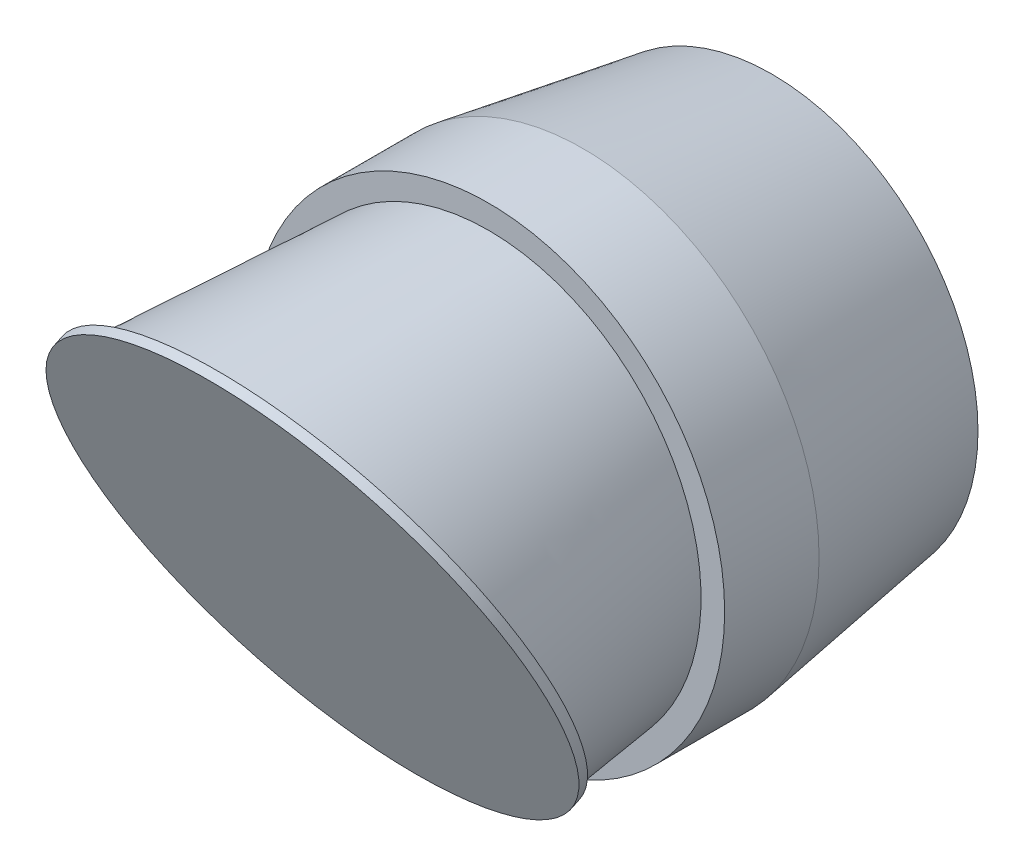
ISO-10303-21;
HEADER;
FILE_DESCRIPTION(('STEP AP214'),'2;1');
FILE_NAME('part.step','',(''),(''),'','','');
FILE_SCHEMA(('AUTOMOTIVE_DESIGN { 1 0 10303 214 1 1 1 1 }'));
ENDSEC;
DATA;
#1=APPLICATION_CONTEXT('core data for automotive mechanical design processes');
#2=APPLICATION_PROTOCOL_DEFINITION('international standard','automotive_design',2000,#1);
#3=PRODUCT_CONTEXT('',#1,'mechanical');
#4=PRODUCT('Part','Part','',(#3));
#5=PRODUCT_RELATED_PRODUCT_CATEGORY('part','',(#4));
#6=PRODUCT_DEFINITION_FORMATION('','',#4);
#7=PRODUCT_DEFINITION_CONTEXT('part definition',#1,'design');
#8=PRODUCT_DEFINITION('design','',#6,#7);
#9=PRODUCT_DEFINITION_SHAPE('','',#8);
#10=(LENGTH_UNIT() NAMED_UNIT(*) SI_UNIT(.MILLI.,.METRE.));
#11=(NAMED_UNIT(*) PLANE_ANGLE_UNIT() SI_UNIT($,.RADIAN.));
#12=(NAMED_UNIT(*) SI_UNIT($,.STERADIAN.) SOLID_ANGLE_UNIT());
#13=UNCERTAINTY_MEASURE_WITH_UNIT(LENGTH_MEASURE(1.E-05),#10,'distance_accuracy_value','');
#14=(GEOMETRIC_REPRESENTATION_CONTEXT(3) GLOBAL_UNCERTAINTY_ASSIGNED_CONTEXT((#13)) GLOBAL_UNIT_ASSIGNED_CONTEXT((#10,
#11,#12)) REPRESENTATION_CONTEXT('',''));
#15=CARTESIAN_POINT('',(0.,0.,0.));
#16=DIRECTION('',(0.,0.,1.));
#17=DIRECTION('',(1.,0.,0.));
#18=AXIS2_PLACEMENT_3D('',#15,#16,#17);
#19=CARTESIAN_POINT('',(-0.0915261603849243,45.3153134300209,58.4354903365128));
#20=CARTESIAN_POINT('',(0.136420864769052,44.9997932144989,0.));
#21=CARTESIAN_POINT('',(1.99180368251297,45.318769716349,58.4371020292964));
#22=CARTESIAN_POINT('',(2.0114122487065,44.9941090118001,0.));
#23=CARTESIAN_POINT('',(4.20687322442163,45.2053319955966,58.3842051513859));
#24=CARTESIAN_POINT('',(4.00440356740127,44.8717692649356,0.));
#25=CARTESIAN_POINT('',(8.88600843009396,44.6452762741459,58.1230468794799));
#26=CARTESIAN_POINT('',(8.21287138961848,44.2951427182916,0.));
#27=CARTESIAN_POINT('',(11.3507489286897,44.1983887328599,57.9146597966442));
#28=CARTESIAN_POINT('',(10.4289539359028,43.8405853040629,0.));
#29=CARTESIAN_POINT('',(16.473473931919,42.8534655410299,57.2875118126636));
#30=CARTESIAN_POINT('',(15.0328583245731,42.4826219835042,0.));
#31=CARTESIAN_POINT('',(19.1321434084322,41.9546959878133,56.8684086870822));
#32=CARTESIAN_POINT('',(17.4212930909019,41.5784842936332,0.));
#33=CARTESIAN_POINT('',(24.5234664819417,39.5837345381366,55.7628112059077));
#34=CARTESIAN_POINT('',(22.2619789213898,39.2004605026345,0.));
#35=CARTESIAN_POINT('',(27.256405564097,38.1102097578422,55.0756953163752));
#36=CARTESIAN_POINT('',(24.7144804836654,37.725249560772,0.));
#37=CARTESIAN_POINT('',(32.5970520547464,34.4938327764405,53.3893510351721));
#38=CARTESIAN_POINT('',(29.5035447573637,34.1107145447033,0.));
#39=CARTESIAN_POINT('',(35.2040025834443,32.3492517405971,52.3893164746243));
#40=CARTESIAN_POINT('',(31.839417937784,31.9696770005361,0.));
#41=CARTESIAN_POINT('',(38.8144809738959,28.6136756898541,50.6473887545425));
#42=CARTESIAN_POINT('',(35.0707738045262,28.2443449257658,0.));
#43=CARTESIAN_POINT('',(39.967462866239,27.2827887015305,50.0267859597484));
#44=CARTESIAN_POINT('',(36.1020193937648,26.9176910575336,0.));
#45=CARTESIAN_POINT('',(42.1345760189165,24.4582205526071,48.7096682009247));
#46=CARTESIAN_POINT('',(38.0387604703795,24.1033316795352,0.));
#47=CARTESIAN_POINT('',(43.1486145302007,22.9645184375814,48.0131434656859));
#48=CARTESIAN_POINT('',(38.9441723834239,22.6156057672877,0.));
#49=CARTESIAN_POINT('',(45.0003894886421,19.8315722116284,46.5522266479362));
#50=CARTESIAN_POINT('',(40.5956235148861,19.4963980850011,0.));
#51=CARTESIAN_POINT('',(45.8380211625777,18.1923378721125,45.7878391219093));
#52=CARTESIAN_POINT('',(41.341568485698,17.8649264767255,0.));
#53=CARTESIAN_POINT('',(47.3030565529074,14.7945221628685,44.2034116356894));
#54=CARTESIAN_POINT('',(42.6436792652381,14.484388202474,0.));
#55=CARTESIAN_POINT('',(47.9303582483154,13.035986557773,43.3833930158952));
#56=CARTESIAN_POINT('',(43.1997534771271,12.7353674285086,0.));
#57=CARTESIAN_POINT('',(48.9474972561602,9.43388789787075,41.7037068253529));
#58=CARTESIAN_POINT('',(44.0977759490185,9.15393032384621,0.));
#59=CARTESIAN_POINT('',(49.3372527930968,7.59040502761342,40.8440766452743));
#60=CARTESIAN_POINT('',(44.4396509990916,7.32159397652263,0.));
#61=CARTESIAN_POINT('',(49.8615783462246,3.85895296529433,39.1040719725767));
#62=CARTESIAN_POINT('',(44.89352205437,3.61386176159297,0.));
#63=CARTESIAN_POINT('',(49.9961026395335,1.97108893145864,38.2237465160437));
#64=CARTESIAN_POINT('',(45.0054774171975,1.7385705191684,0.));
#65=CARTESIAN_POINT('',(50.0037298195655,-1.80518718770977,36.4628400423676));
#66=CARTESIAN_POINT('',(44.9941090118001,-2.01141224870651,0.));
#67=CARTESIAN_POINT('',(49.8768324753335,-3.69348492532732,35.5823123464398));
#68=CARTESIAN_POINT('',(44.8707855878167,-3.8859902226188,0.));
#69=CARTESIAN_POINT('',(49.3675836777205,-7.42665170839009,33.8415080863278));
#70=CARTESIAN_POINT('',(44.394442443503,-7.59090241068915,0.));
#71=CARTESIAN_POINT('',(48.9852775221274,-9.27141544460413,32.9812806286446));
#72=CARTESIAN_POINT('',(44.0414639991588,-9.42113224800847,0.));
#73=CARTESIAN_POINT('',(47.982696047958,-12.8768648616188,31.3000319544001));
#74=CARTESIAN_POINT('',(43.1217433447526,-12.9970587031433,0.));
#75=CARTESIAN_POINT('',(47.3625021804274,-14.6374700870739,30.4790482547827));
#76=CARTESIAN_POINT('',(42.5550748282234,-14.7426757829363,0.));
#77=CARTESIAN_POINT('',(45.9112021221814,-18.0401240557866,28.8923646511204));
#78=CARTESIAN_POINT('',(41.2324913677267,-18.1152570637795,0.));
#79=CARTESIAN_POINT('',(45.0801977669015,-19.6821266962099,28.1266862451804));
#80=CARTESIAN_POINT('',(40.4766682971636,-19.7421759290256,0.));
#81=CARTESIAN_POINT('',(43.2410907891363,-22.8211961699137,26.6629141101117));
#82=CARTESIAN_POINT('',(38.8063353851105,-22.8513133283305,0.));
#83=CARTESIAN_POINT('',(42.2330928996986,-24.3182528842077,25.964825099544));
#84=CARTESIAN_POINT('',(37.8919198511061,-24.3335222722471,0.));
#85=CARTESIAN_POINT('',(40.0774041443407,-27.1499926488908,24.6443631613703));
#86=CARTESIAN_POINT('',(35.9381505701479,-27.1360872229946,0.));
#87=CARTESIAN_POINT('',(38.9298061114948,-28.4846963458211,24.0219806061238));
#88=CARTESIAN_POINT('',(34.898880272287,-28.4564641386531,0.));
#89=CARTESIAN_POINT('',(35.3344418177103,-32.232227035258,22.2744783464686));
#90=CARTESIAN_POINT('',(31.6449966590639,-32.1621356346764,0.));
#91=CARTESIAN_POINT('',(32.7361718185315,-34.3854436371912,21.2704169553206));
#92=CARTESIAN_POINT('',(29.2961850429148,-34.2889711413349,0.));
#93=CARTESIAN_POINT('',(27.4101695135437,-38.0195168045928,19.5758208070656));
#94=CARTESIAN_POINT('',(24.4852934308534,-37.8744030395861,0.));
#95=CARTESIAN_POINT('',(24.6832010661055,-39.5020996818619,18.8844810575456));
#96=CARTESIAN_POINT('',(22.0238925642925,-39.3347170503553,0.));
#97=CARTESIAN_POINT('',(19.3014916481243,-41.8909338102407,17.7705494094206));
#98=CARTESIAN_POINT('',(17.1688774623126,-41.6833474639346,0.));
#99=CARTESIAN_POINT('',(16.6464705785346,-42.7985188835002,17.3473355393325));
#100=CARTESIAN_POINT('',(14.7750047007109,-42.5729871643272,0.));
#101=CARTESIAN_POINT('',(11.5292127379522,-44.1604304138901,16.7122657629821));
#102=CARTESIAN_POINT('',(10.1629514390518,-43.9030114917812,0.));
#103=CARTESIAN_POINT('',(9.06629396427845,-44.6154930415315,16.5000665747727));
#104=CARTESIAN_POINT('',(7.94415358942495,-44.3441241727003,0.));
#105=CARTESIAN_POINT('',(4.38945246769244,-45.1910705174813,16.2316703898759));
#106=CARTESIAN_POINT('',(3.73226696567856,-44.8952236679264,0.));
#107=CARTESIAN_POINT('',(2.17485600328283,-45.3118571436927,16.1753466610707));
#108=CARTESIAN_POINT('',(1.73857051916838,-45.0054774171976,0.));
#109=CARTESIAN_POINT('',(-1.99180368251297,-45.318769716349,16.1721232755036));
#110=CARTESIAN_POINT('',(-2.0114122487065,-44.9941090118001,0.));
#111=CARTESIAN_POINT('',(-4.20687322442164,-45.2053319955966,16.2250201534141));
#112=CARTESIAN_POINT('',(-4.00440356740125,-44.8717692649356,0.));
#113=CARTESIAN_POINT('',(-8.88600843009394,-44.6452762741459,16.48617842532));
#114=CARTESIAN_POINT('',(-8.2128713896185,-44.2951427182916,0.));
#115=CARTESIAN_POINT('',(-11.3507489286896,-44.1983887328599,16.6945655081558));
#116=CARTESIAN_POINT('',(-10.4289539359029,-43.8405853040629,0.));
#117=CARTESIAN_POINT('',(-16.473473931919,-42.8534655410299,17.3217134921364));
#118=CARTESIAN_POINT('',(-15.0328583245731,-42.4826219835042,0.));
#119=CARTESIAN_POINT('',(-19.1321434084321,-41.9546959878133,17.7408166177178));
#120=CARTESIAN_POINT('',(-17.4212930909018,-41.5784842936333,0.));
#121=CARTESIAN_POINT('',(-24.5234664819417,-39.5837345381366,18.8464140988923));
#122=CARTESIAN_POINT('',(-22.2619789213898,-39.2004605026345,0.));
#123=CARTESIAN_POINT('',(-27.256405564097,-38.1102097578422,19.5335299884248));
#124=CARTESIAN_POINT('',(-24.7144804836654,-37.7252495607719,0.));
#125=CARTESIAN_POINT('',(-32.5970520547464,-34.4938327764405,21.2198742696279));
#126=CARTESIAN_POINT('',(-29.5035447573637,-34.1107145447033,0.));
#127=CARTESIAN_POINT('',(-35.2040025834443,-32.3492517405971,22.2199088301756));
#128=CARTESIAN_POINT('',(-31.839417937784,-31.9696770005361,0.));
#129=CARTESIAN_POINT('',(-38.8144809738959,-28.6136756898541,23.9618365502575));
#130=CARTESIAN_POINT('',(-35.0707738045262,-28.2443449257658,0.));
#131=CARTESIAN_POINT('',(-39.967462866239,-27.2827887015305,24.5824393450516));
#132=CARTESIAN_POINT('',(-36.1020193937648,-26.9176910575336,0.));
#133=CARTESIAN_POINT('',(-42.1345760189165,-24.4582205526071,25.8995571038753));
#134=CARTESIAN_POINT('',(-38.0387604703795,-24.1033316795352,0.));
#135=CARTESIAN_POINT('',(-43.1486145302006,-22.9645184375814,26.5960818391141));
#136=CARTESIAN_POINT('',(-38.9441723834239,-22.6156057672877,0.));
#137=CARTESIAN_POINT('',(-45.000389488642,-19.8315722116284,28.0569986568638));
#138=CARTESIAN_POINT('',(-40.5956235148861,-19.4963980850011,0.));
#139=CARTESIAN_POINT('',(-45.8380211625776,-18.1923378721125,28.8213861828907));
#140=CARTESIAN_POINT('',(-41.341568485698,-17.8649264767255,0.));
#141=CARTESIAN_POINT('',(-47.3030565529074,-14.7945221628685,30.4058136691105));
#142=CARTESIAN_POINT('',(-42.6436792652381,-14.484388202474,0.));
#143=CARTESIAN_POINT('',(-47.9303582483154,-13.035986557773,31.2258322889048));
#144=CARTESIAN_POINT('',(-43.1997534771271,-12.7353674285086,0.));
#145=CARTESIAN_POINT('',(-48.9474972561602,-9.43388789787077,32.9055184794471));
#146=CARTESIAN_POINT('',(-44.0977759490185,-9.15393032384621,0.));
#147=CARTESIAN_POINT('',(-49.3372527930968,-7.59040502761344,33.7651486595256));
#148=CARTESIAN_POINT('',(-44.4396509990916,-7.32159397652267,0.));
#149=CARTESIAN_POINT('',(-49.8615783462246,-3.85895296529435,35.5051533322233));
#150=CARTESIAN_POINT('',(-44.8935220543701,-3.61386176159296,0.));
#151=CARTESIAN_POINT('',(-49.9961026395335,-1.97108893145862,36.3854787887563));
#152=CARTESIAN_POINT('',(-45.0054774171976,-1.73857051916839,0.));
#153=CARTESIAN_POINT('',(-50.0037298195655,1.80518718770974,38.1463852624324));
#154=CARTESIAN_POINT('',(-44.9941090118001,2.0114122487065,0.));
#155=CARTESIAN_POINT('',(-49.8768324753335,3.69348492532728,39.0269129583602));
#156=CARTESIAN_POINT('',(-44.8707855878168,3.88599022261881,0.));
#157=CARTESIAN_POINT('',(-49.3675836777205,7.42665170839007,40.7677172184722));
#158=CARTESIAN_POINT('',(-44.3944424435031,7.59090241068915,0.));
#159=CARTESIAN_POINT('',(-48.9852775221274,9.2714154446041,41.6279446761554));
#160=CARTESIAN_POINT('',(-44.0414639991589,9.42113224800847,0.));
#161=CARTESIAN_POINT('',(-47.982696047958,12.8768648616188,43.3091933503998));
#162=CARTESIAN_POINT('',(-43.1217433447526,12.9970587031433,0.));
#163=CARTESIAN_POINT('',(-47.3625021804275,14.6374700870738,44.1301770500173));
#164=CARTESIAN_POINT('',(-42.5550748282234,14.7426757829363,0.));
#165=CARTESIAN_POINT('',(-45.9112021221814,18.0401240557866,45.7168606536795));
#166=CARTESIAN_POINT('',(-41.2324913677267,18.1152570637795,0.));
#167=CARTESIAN_POINT('',(-45.0801977669015,19.6821266962098,46.4825390596196));
#168=CARTESIAN_POINT('',(-40.4766682971637,19.7421759290256,0.));
#169=CARTESIAN_POINT('',(-43.2410907891363,22.8211961699137,47.9463111946883));
#170=CARTESIAN_POINT('',(-38.8063353851105,22.8513133283305,0.));
#171=CARTESIAN_POINT('',(-42.2330928996986,24.3182528842077,48.644400205256));
#172=CARTESIAN_POINT('',(-37.8919198511061,24.3335222722471,0.));
#173=CARTESIAN_POINT('',(-40.0774041443407,27.1499926488908,49.9648621434297));
#174=CARTESIAN_POINT('',(-35.9381505701479,27.1360872229946,0.));
#175=CARTESIAN_POINT('',(-38.9298061114948,28.4846963458212,50.5872446986761));
#176=CARTESIAN_POINT('',(-34.898880272287,28.4564641386531,0.));
#177=CARTESIAN_POINT('',(-35.3344418177103,32.232227035258,52.3347469583314));
#178=CARTESIAN_POINT('',(-31.6449966590639,32.1621356346764,0.));
#179=CARTESIAN_POINT('',(-32.7361718185316,34.3854436371912,53.3388083494794));
#180=CARTESIAN_POINT('',(-29.2961850429148,34.2889711413349,0.));
#181=CARTESIAN_POINT('',(-27.4101695135438,38.0195168045928,55.0334044977343));
#182=CARTESIAN_POINT('',(-24.4852934308533,37.8744030395861,0.));
#183=CARTESIAN_POINT('',(-24.6832010661055,39.5020996818619,55.7247442472544));
#184=CARTESIAN_POINT('',(-22.0238925642926,39.3347170503553,0.));
#185=CARTESIAN_POINT('',(-19.3014916481243,41.8909338102407,56.8386758953794));
#186=CARTESIAN_POINT('',(-17.1688774623126,41.6833474639346,0.));
#187=CARTESIAN_POINT('',(-16.6464705785346,42.7985188835002,57.2618897654675));
#188=CARTESIAN_POINT('',(-14.775004700711,42.5729871643272,0.));
#189=CARTESIAN_POINT('',(-11.5292127379522,44.1604304138901,57.8969595418179));
#190=CARTESIAN_POINT('',(-10.1629514390518,43.9030114917812,0.));
#191=CARTESIAN_POINT('',(-9.06629396427852,44.6154930415315,58.1091587300272));
#192=CARTESIAN_POINT('',(-7.94415358942493,44.3441241727003,0.));
#193=CARTESIAN_POINT('',(-4.38945246769247,45.1910705174812,58.3775549149241));
#194=CARTESIAN_POINT('',(-3.73226696567858,44.8952236679264,0.));
#195=CARTESIAN_POINT('',(-2.1748560032828,45.3118571436928,58.4338786437293));
#196=CARTESIAN_POINT('',(-1.73857051916838,45.0054774171976,0.));
#197=CARTESIAN_POINT('',(-0.0915261603849243,45.3153134300209,58.4354903365128));
#198=CARTESIAN_POINT('',(0.136420864769052,44.9997932144989,0.));
#199=B_SPLINE_SURFACE_WITH_KNOTS('',3,1,((#19,#20),(#21,#22),(#23,#24),(#25,#26),(#27,#28),(#29,
#30),(#31,#32),(#33,#34),(#35,#36),(#37,#38),(#39,#40),(#41,#42),(#43,#44),(#45,#46),(#47,#48),
(#49,#50),(#51,#52),(#53,#54),(#55,#56),(#57,#58),(#59,#60),(#61,#62),(#63,#64),(#65,#66),(#67,
#68),(#69,#70),(#71,#72),(#73,#74),(#75,#76),(#77,#78),(#79,#80),(#81,#82),(#83,#84),(#85,#86),
(#87,#88),(#89,#90),(#91,#92),(#93,#94),(#95,#96),(#97,#98),(#99,#100),(#101,#102),(#103,#104),
(#105,#106),(#107,#108),(#109,#110),(#111,#112),(#113,#114),(#115,#116),(#117,#118),(#119,#120),
(#121,#122),(#123,#124),(#125,#126),(#127,#128),(#129,#130),(#131,#132),(#133,#134),(#135,#136),
(#137,#138),(#139,#140),(#141,#142),(#143,#144),(#145,#146),(#147,#148),(#149,#150),(#151,#152),
(#153,#154),(#155,#156),(#157,#158),(#159,#160),(#161,#162),(#163,#164),(#165,#166),(#167,#168),
(#169,#170),(#171,#172),(#173,#174),(#175,#176),(#177,#178),(#179,#180),(#181,#182),(#183,#184),
(#185,#186),(#187,#188),(#189,#190),(#191,#192),(#193,#194),(#195,#196),(#197,#198)),
.UNSPECIFIED.,.T.,.F.,.F.,(4,2,2,2,2,2,2,2,2,2,2,2,2,2,2,2,2,2,2,2,2,2,2,2,2,2,2,2,2,2,2,2,2,2,
2,2,2,2,2,2,2,2,2,2,4),(2,2),(0.,0.03125,0.0625000000000001,0.0937500000000001,0.125,0.15625,
0.171875,0.1875,0.203125,0.21875,0.234375,0.25,0.265625,0.28125,0.296875,0.3125,0.328125,
0.34375,0.375,0.40625,0.4375,0.46875,0.5,0.53125,0.5625,0.59375,0.625,0.65625,0.671875,0.6875,
0.703125,0.71875,0.734375,0.75,0.765625,0.78125,0.796875,0.8125,0.828125,0.84375,0.875,0.90625,
0.9375,0.96875,1.),(0.,1.),.UNSPECIFIED.);
#200=CARTESIAN_POINT('',(0.,0.,0.));
#201=DIRECTION('',(0.,0.,1.));
#202=DIRECTION('',(1.,0.,0.));
#203=AXIS2_PLACEMENT_3D('',#200,#201,#202);
#204=CIRCLE('',#203,45.);
#205=CARTESIAN_POINT('',(0.136420864769052,44.9997932144989,0.));
#206=VERTEX_POINT('',#205);
#207=EDGE_CURVE('E74',#206,#206,#204,.T.);
#208=CARTESIAN_POINT('',(-0.0828962483198909,45.3033680593241,56.2231642807524));
#209=CARTESIAN_POINT('',(0.614322970114404,45.3044165847627,56.2236532161942));
#210=CARTESIAN_POINT('',(1.31152631421928,45.2922304963553,56.2179707498469));
#211=CARTESIAN_POINT('',(2.70476936651377,45.2411705564025,56.194161108822));
#212=CARTESIAN_POINT('',(3.4008090718102,45.202296638601,56.1760339032487));
#213=CARTESIAN_POINT('',(4.79053986829543,45.0979014032344,56.1273536055223));
#214=CARTESIAN_POINT('',(5.48423061903546,45.0323763767401,56.0967987838672));
#215=CARTESIAN_POINT('',(6.86813861350113,44.8750168674565,56.0234208396048));
#216=CARTESIAN_POINT('',(7.55835498705075,44.7831760978015,55.9805947853838));
#217=CARTESIAN_POINT('',(8.9345259041808,44.5731077564014,55.882638309053));
#218=CARTESIAN_POINT('',(9.620476034464,44.4548564224747,55.8274968064559));
#219=CARTESIAN_POINT('',(10.9863000136747,44.1921327347368,55.704986738885));
#220=CARTESIAN_POINT('',(11.6661733055267,44.0476580023258,55.6376170647519));
#221=CARTESIAN_POINT('',(13.0185656339639,43.7328706532323,55.4908293131793));
#222=CARTESIAN_POINT('',(13.6910849780696,43.5625591214327,55.411411741629));
#223=CARTESIAN_POINT('',(15.0276247289076,43.1964554007139,55.2406947729788));
#224=CARTESIAN_POINT('',(15.691645162942,43.0006632936715,55.1493954140586));
#225=CARTESIAN_POINT('',(17.0096737911965,42.5839399935944,54.9550741479011));
#226=CARTESIAN_POINT('',(17.6636864127556,42.3630203042414,54.8520576049185));
#227=CARTESIAN_POINT('',(18.9607819797835,41.8963681283607,54.6344541216107));
#228=CARTESIAN_POINT('',(19.6038658072617,41.6506376554074,54.5198681202305));
#229=CARTESIAN_POINT('',(20.8780575678954,41.1348439263554,54.2793495543452));
#230=CARTESIAN_POINT('',(21.5091652430984,40.864780146864,54.1534167457781));
#231=CARTESIAN_POINT('',(22.7583096085154,40.3007776636815,53.8904180686516));
#232=CARTESIAN_POINT('',(23.3763454147328,40.006837351784,53.7533514501734));
#233=CARTESIAN_POINT('',(24.5980321716209,39.3957101300157,53.4683781465558));
#234=CARTESIAN_POINT('',(25.2016871770222,39.0785298780552,53.3204745660511));
#235=CARTESIAN_POINT('',(26.3937258079446,38.4214144007535,53.0140565866931));
#236=CARTESIAN_POINT('',(26.9821094282627,38.0814791676599,52.8555421842249));
#237=CARTESIAN_POINT('',(28.1425575928091,37.3794537075423,52.5281823359523));
#238=CARTESIAN_POINT('',(28.7146222039561,37.0173635713872,52.3593369325208));
#239=CARTESIAN_POINT('',(29.8414026293618,36.2716542462271,52.011606963441));
#240=CARTESIAN_POINT('',(30.3961183989058,35.8880350017402,51.8327223719211));
#241=CARTESIAN_POINT('',(31.4873907475535,35.0997821280971,51.4651540203787));
#242=CARTESIAN_POINT('',(32.0239411742115,34.695141494485,51.2764669941246));
#243=CARTESIAN_POINT('',(33.0777746580903,33.865840809442,50.8897577337759));
#244=CARTESIAN_POINT('',(33.5950576599303,33.4411807004765,50.6917354728524));
#245=CARTESIAN_POINT('',(35.1167310532874,32.1381684189927,50.0841308673264));
#246=CARTESIAN_POINT('',(36.0911894614536,31.230608240404,49.660928605814));
#247=CARTESIAN_POINT('',(37.4866017242029,29.8162316783581,49.0013939834171));
#248=CARTESIAN_POINT('',(37.940748437429,29.3358669975876,48.7773962540666));
#249=CARTESIAN_POINT('',(38.8263971010502,28.3582156393799,48.3215099387287));
#250=CARTESIAN_POINT('',(39.2578989831771,27.8609289109347,48.0896213289559));
#251=CARTESIAN_POINT('',(40.0974672607459,26.8503602056943,47.6183854026105));
#252=CARTESIAN_POINT('',(40.5055336209122,26.3370782048245,47.3790380748118));
#253=CARTESIAN_POINT('',(41.297414754756,25.2954400320397,46.8933142178157));
#254=CARTESIAN_POINT('',(41.6812295517761,24.7670838746345,46.6469376953842));
#255=CARTESIAN_POINT('',(42.7970084267108,23.158530715146,45.8968570385653));
#256=CARTESIAN_POINT('',(43.4917495088153,22.0567244618467,45.3830763448489));
#257=CARTESIAN_POINT('',(44.4549224891653,20.367641354685,44.5954439567191));
#258=CARTESIAN_POINT('',(44.7628534897983,19.7984862042705,44.3300425514024));
#259=CARTESIAN_POINT('',(45.3521120862213,18.6489100302908,43.7939863778432));
#260=CARTESIAN_POINT('',(45.6334396907755,18.068489010437,43.5233316113312));
#261=CARTESIAN_POINT('',(46.1688786083611,16.8974375009242,42.9772613243514));
#262=CARTESIAN_POINT('',(46.4229897770759,16.3068069571479,42.7018457786483));
#263=CARTESIAN_POINT('',(46.9035408713656,15.1163675551776,42.1467347689401));
#264=CARTESIAN_POINT('',(47.1299807858795,14.5165586933148,41.8670393032242));
#265=CARTESIAN_POINT('',(47.5549183841089,13.30886641486,41.3038831450861));
#266=CARTESIAN_POINT('',(47.7534160579209,12.7009829954062,41.0204224513293));
#267=CARTESIAN_POINT('',(48.1220130383146,11.4781830831007,40.45022148783));
#268=CARTESIAN_POINT('',(48.292112343699,10.8632665899525,40.1634812179492));
#269=CARTESIAN_POINT('',(48.6039457151178,9.62624594781364,39.586649019224));
#270=CARTESIAN_POINT('',(48.745621668727,9.00412976935535,39.2965514809468));
#271=CARTESIAN_POINT('',(49.0000586688017,7.75505931150467,38.7141003608759));
#272=CARTESIAN_POINT('',(49.1128197119274,7.12810503155347,38.4217467788216));
#273=CARTESIAN_POINT('',(49.3091003790974,5.8704453260467,37.8352904267908));
#274=CARTESIAN_POINT('',(49.3926199459564,5.23973989315776,37.5411876533947));
#275=CARTESIAN_POINT('',(49.5303126798142,3.97570488817377,36.9517584503947));
#276=CARTESIAN_POINT('',(49.5844858273712,3.34237531434054,36.6564320199802));
#277=CARTESIAN_POINT('',(49.6635195402256,2.07421004228951,36.0650768418166));
#278=CARTESIAN_POINT('',(49.6883798606607,1.4393743315347,35.7690480882214));
#279=CARTESIAN_POINT('',(49.7086064357679,0.169316320869723,35.1768103115472));
#280=CARTESIAN_POINT('',(49.7039727101546,-0.465905978781767,34.8806012885889));
#281=CARTESIAN_POINT('',(49.6652780196009,-1.73561189951667,34.2885276941454));
#282=CARTESIAN_POINT('',(49.6312170530758,-2.37009552056031,33.9926631226789));
#283=CARTESIAN_POINT('',(49.5338502647969,-3.63721750422221,33.4017944378808));
#284=CARTESIAN_POINT('',(49.470544427368,-4.26985586585124,33.1067903250105));
#285=CARTESIAN_POINT('',(49.3143651072142,-5.53455543133066,32.5170512323622));
#286=CARTESIAN_POINT('',(49.2213805533817,-6.16660537541652,32.2223215030985));
#287=CARTESIAN_POINT('',(49.0061532437417,-7.42660027670248,31.6347762313926));
#288=CARTESIAN_POINT('',(48.883910360925,-8.05454521607078,31.3419606972655));
#289=CARTESIAN_POINT('',(48.610490003223,-9.30524157989588,30.7587514047872));
#290=CARTESIAN_POINT('',(48.4593125090336,-9.9279930008875,30.4683576480519));
#291=CARTESIAN_POINT('',(48.1281552246824,-11.1671697522478,29.890520039085));
#292=CARTESIAN_POINT('',(47.9481754479972,-11.7835950855764,29.6030761854731));
#293=CARTESIAN_POINT('',(47.5598081780897,-13.0090764209359,29.0316248538689));
#294=CARTESIAN_POINT('',(47.3514201981074,-13.6181322965002,28.747617434849));
#295=CARTESIAN_POINT('',(46.9067162560038,-14.8277493933581,28.183563719149));
#296=CARTESIAN_POINT('',(46.6704003109072,-15.4283106198296,27.9035174200543));
#297=CARTESIAN_POINT('',(45.9199226716421,-17.2157285582814,27.0700307470306));
#298=CARTESIAN_POINT('',(45.3641471485798,-18.3885847743478,26.5231189115642));
#299=CARTESIAN_POINT('',(44.4499103828977,-20.1149612478814,25.7180963410968));
#300=CARTESIAN_POINT('',(44.1310146382624,-20.6860478601862,25.4517942803093));
#301=CARTESIAN_POINT('',(43.4669476071417,-21.8155285423667,24.9251087884704));
#302=CARTESIAN_POINT('',(43.1217764381504,-22.373922668984,24.66472533096));
#303=CARTESIAN_POINT('',(42.0478562317175,-24.0286817500526,23.8930984990562));
#304=CARTESIAN_POINT('',(41.2805658497635,-25.104877478164,23.3912601893642));
#305=CARTESIAN_POINT('',(40.0570584001668,-26.6720495535623,22.6604758489593));
#306=CARTESIAN_POINT('',(39.6370596718401,-27.1866594031332,22.4205093351423));
#307=CARTESIAN_POINT('',(38.7735880975689,-28.1994584150025,21.9482333997359));
#308=CARTESIAN_POINT('',(38.3301168907903,-28.6976487200031,21.7159234452955));
#309=CARTESIAN_POINT('',(37.4204284063959,-29.6766499774902,21.2594076615859));
#310=CARTESIAN_POINT('',(36.9542111329638,-30.1574609331731,21.0352018308262));
#311=CARTESIAN_POINT('',(35.9997702185525,-31.1008729791626,20.5952815689856));
#312=CARTESIAN_POINT('',(35.5115447417904,-31.5634725443404,20.379567849084));
#313=CARTESIAN_POINT('',(34.5130536179746,-32.4705690929393,19.9565817817864));
#314=CARTESIAN_POINT('',(34.0027454128354,-32.9150275925948,19.7493273796649));
#315=CARTESIAN_POINT('',(32.9619212894825,-33.7840672684697,19.3440875235639));
#316=CARTESIAN_POINT('',(32.4314053351719,-34.2086484091794,19.1461020861428));
#317=CARTESIAN_POINT('',(31.3510521179311,-35.0371542501816,18.7597634676573));
#318=CARTESIAN_POINT('',(30.8012141753989,-35.4410782226811,18.5714106259684));
#319=CARTESIAN_POINT('',(29.6831526155511,-36.2273586511223,18.2047620407289));
#320=CARTESIAN_POINT('',(29.1149306617757,-36.609717049957,18.0264653911924));
#321=CARTESIAN_POINT('',(27.9610138215323,-37.3523320372822,17.680178335542));
#322=CARTESIAN_POINT('',(27.375315799134,-37.7125846231934,17.5121897958614));
#323=CARTESIAN_POINT('',(26.1877112751258,-38.4101244041557,17.186921654131));
#324=CARTESIAN_POINT('',(25.5858089304549,-38.7474174122083,17.0296393414339));
#325=CARTESIAN_POINT('',(24.366668565032,-39.3985357851599,16.7260178577611));
#326=CARTESIAN_POINT('',(23.749429136355,-39.7123589848774,16.5796796964262));
#327=CARTESIAN_POINT('',(22.5006986421583,-40.3158772004004,16.2982545306917));
#328=CARTESIAN_POINT('',(21.8692066258862,-40.6055706004886,16.1631682797137));
#329=CARTESIAN_POINT('',(20.596500177048,-41.1588152965433,15.9051860411097));
#330=CARTESIAN_POINT('',(19.9553540345256,-41.4224956303825,15.7822298821356));
#331=CARTESIAN_POINT('',(18.6611564445376,-41.9248529241598,15.5479768289172));
#332=CARTESIAN_POINT('',(18.0081036518642,-42.163527038097,15.436681261785));
#333=CARTESIAN_POINT('',(16.6913646089622,-42.6153134509524,15.2260097976201));
#334=CARTESIAN_POINT('',(16.0276789967762,-42.8284272772002,15.1266331883821));
#335=CARTESIAN_POINT('',(14.6908487297126,-43.2287058885301,14.9399802065233));
#336=CARTESIAN_POINT('',(14.017704061388,-43.4158706367186,14.8527038511063));
#337=CARTESIAN_POINT('',(12.6632625195109,-43.7639118939745,14.690409547494));
#338=CARTESIAN_POINT('',(11.9819664935191,-43.9247911110947,14.6153903365129));
#339=CARTESIAN_POINT('',(10.6123890143793,-44.2197565528697,14.4778456921221));
#340=CARTESIAN_POINT('',(9.92410791440999,-44.3538441251392,14.4153196303094));
#341=CARTESIAN_POINT('',(8.54182556008515,-44.5949251335236,14.3029017098641));
#342=CARTESIAN_POINT('',(7.84782475794462,-44.701920690785,14.2530088621245));
#343=CARTESIAN_POINT('',(6.80349244378417,-44.8420437519504,14.187668405619));
#344=CARTESIAN_POINT('',(6.45479045678543,-44.8853597998358,14.167469800769));
#345=CARTESIAN_POINT('',(5.75641785666414,-44.9651900372901,14.1302443496917));
#346=CARTESIAN_POINT('',(5.4067471869691,-45.0017038207196,14.1132176928503));
#347=CARTESIAN_POINT('',(4.36861785364647,-45.0997993179015,14.0674750112839));
#348=CARTESIAN_POINT('',(3.67899873405947,-45.1515490588499,14.0433437107721));
#349=CARTESIAN_POINT('',(2.29793252100945,-45.2283003221974,14.0075540089001));
#350=CARTESIAN_POINT('',(1.60648537969514,-45.2533011373112,13.9958959373524));
#351=CARTESIAN_POINT('',(0.568841659575597,-45.270828399215,13.9877228409002));
#352=CARTESIAN_POINT('',(0.222820151719702,-45.2733404989365,13.986551429562));
#353=CARTESIAN_POINT('',(-0.469200217191052,-45.2717374839527,13.9872989277251));
#354=CARTESIAN_POINT('',(-0.815199078439621,-45.2676224362986,13.9892178059599));
#355=CARTESIAN_POINT('',(-1.85311445171972,-45.2452599624837,13.999645598755));
#356=CARTESIAN_POINT('',(-2.54480167631585,-45.2169926818978,14.0128268481675));
#357=CARTESIAN_POINT('',(-3.92593572967537,-45.1336985142854,14.0516675564048));
#358=CARTESIAN_POINT('',(-4.61538327934695,-45.0786813260444,14.0773224926117));
#359=CARTESIAN_POINT('',(-5.99117127516512,-44.9421895461595,14.1409696548473));
#360=CARTESIAN_POINT('',(-6.67751132899118,-44.860711703378,14.1789633969062));
#361=CARTESIAN_POINT('',(-8.04564919955119,-44.6715353270825,14.2671777899148));
#362=CARTESIAN_POINT('',(-8.7274478223204,-44.5638415811694,14.3173962083695));
#363=CARTESIAN_POINT('',(-10.0852973346542,-44.3223034121388,14.4300273063252));
#364=CARTESIAN_POINT('',(-10.7613489180794,-44.1884621940697,14.4924384912876));
#365=CARTESIAN_POINT('',(-12.1009578403087,-43.8961770904392,14.6287332734752));
#366=CARTESIAN_POINT('',(-12.7645723903183,-43.7379484250319,14.7025165118942));
#367=CARTESIAN_POINT('',(-14.0837888658961,-43.3966107105033,14.861684902196));
#368=CARTESIAN_POINT('',(-14.7393927052355,-43.2135077357725,14.947067221544));
#369=CARTESIAN_POINT('',(-16.0416543629699,-42.8226559018592,15.1293244249017));
#370=CARTESIAN_POINT('',(-16.6883114644929,-42.6149050803525,15.2262002239582));
#371=CARTESIAN_POINT('',(-17.9715476274415,-42.1751399117721,15.4312660898571));
#372=CARTESIAN_POINT('',(-18.6081259891604,-41.9431238885409,15.5394569383045));
#373=CARTESIAN_POINT('',(-19.8701226302843,-41.4552939277753,15.7669357848869));
#374=CARTESIAN_POINT('',(-20.4955405582704,-41.1994792424409,15.8862241317269));
#375=CARTESIAN_POINT('',(-21.7341135214454,-40.6646500711562,16.1356190701016));
#376=CARTESIAN_POINT('',(-22.3472685063513,-40.3856354901014,16.2657257059844));
#377=CARTESIAN_POINT('',(-24.1668929437338,-39.5144344549683,16.6719734204595));
#378=CARTESIAN_POINT('',(-25.3537856859065,-38.8879886695369,16.9640898876251));
#379=CARTESIAN_POINT('',(-27.0965542732135,-37.8788760118138,17.4346468478625));
#380=CARTESIAN_POINT('',(-27.6753197069389,-37.5280949643831,17.5982187366151));
#381=CARTESIAN_POINT('',(-28.8161207468728,-36.8050279708948,17.9353904130378));
#382=CARTESIAN_POINT('',(-29.3781605381227,-36.4327474741021,18.108987659674));
#383=CARTESIAN_POINT('',(-30.4846272086817,-35.6671976900359,18.465969386683));
#384=CARTESIAN_POINT('',(-31.0290522967441,-35.2739262788949,18.6493548574314));
#385=CARTESIAN_POINT('',(-32.0994414695159,-34.4671913842661,19.0255415168977));
#386=CARTESIAN_POINT('',(-32.6254042541702,-34.0537264837015,19.2183433664093));
#387=CARTESIAN_POINT('',(-33.6579787278293,-33.2073889522513,19.6129970387085));
#388=CARTESIAN_POINT('',(-34.1645900606967,-32.7745159645043,19.8148490279034));
#389=CARTESIAN_POINT('',(-35.1575704481807,-31.8901204437942,20.2272494320484));
#390=CARTESIAN_POINT('',(-35.6439399511594,-31.4385983243564,20.4377976541687));
#391=CARTESIAN_POINT('',(-36.5955599689871,-30.5176201842906,20.8672568138747));
#392=CARTESIAN_POINT('',(-37.0608102807891,-30.0481639913186,21.0861678318259));
#393=CARTESIAN_POINT('',(-37.9693846543743,-29.0921303004457,21.5319736633341));
#394=CARTESIAN_POINT('',(-38.4127085047237,-28.6055526375224,21.7588685538424));
#395=CARTESIAN_POINT('',(-39.2826985631743,-27.6093787172187,22.2233920817343));
#396=CARTESIAN_POINT('',(-39.7090518279491,-27.09955791942,22.4611254240345));
#397=CARTESIAN_POINT('',(-40.5377187812106,-26.0641180261376,22.9439589758313));
#398=CARTESIAN_POINT('',(-40.9400324622215,-25.5384989257409,23.1890591876188));
#399=CARTESIAN_POINT('',(-41.7199261252455,-24.4723720638433,23.6862023078864));
#400=CARTESIAN_POINT('',(-42.0975058166738,-23.9318641275283,23.9382452978836));
#401=CARTESIAN_POINT('',(-42.827289373043,-22.8370244033053,24.4487774457411));
#402=CARTESIAN_POINT('',(-43.179493244136,-22.2826926187488,24.7072666020386));
#403=CARTESIAN_POINT('',(-44.197003154247,-20.6001813062919,25.4918345119696));
#404=CARTESIAN_POINT('',(-44.8233650901708,-19.452270431977,26.0271141435421));
#405=CARTESIAN_POINT('',(-45.6813432977101,-17.6982265659422,26.8450382310139));
#406=CARTESIAN_POINT('',(-45.9537673301418,-17.1081158414443,27.1202113810067));
#407=CARTESIAN_POINT('',(-46.4709227175297,-15.9179440419028,27.675197605653));
#408=CARTESIAN_POINT('',(-46.7156540520626,-15.3178829595213,27.9550106837283));
#409=CARTESIAN_POINT('',(-47.1776709569242,-14.1073851582341,28.5194750786483));
#410=CARTESIAN_POINT('',(-47.3948822453379,-13.4969251998958,28.8041372322184));
#411=CARTESIAN_POINT('',(-47.8007014592425,-12.2682391533867,29.3770829451738));
#412=CARTESIAN_POINT('',(-47.989309388197,-11.6500130661562,29.6653665041206));
#413=CARTESIAN_POINT('',(-48.3374425761111,-10.4068686966525,30.2450542438124));
#414=CARTESIAN_POINT('',(-48.4969677216285,-9.78195038828515,30.5364584367254));
#415=CARTESIAN_POINT('',(-48.7867900771994,-8.52657668233525,31.1218488096562));
#416=CARTESIAN_POINT('',(-48.9170872811296,-7.89612128359267,31.4158349902151));
#417=CARTESIAN_POINT('',(-49.1481606833999,-6.63076732107659,32.0058792332131));
#418=CARTESIAN_POINT('',(-49.2489370695208,-5.99586878559204,32.3019372824609));
#419=CARTESIAN_POINT('',(-49.4206607739921,-4.72282999027188,32.8955650218471));
#420=CARTESIAN_POINT('',(-49.4916080778316,-4.08468972885946,33.1931347127208));
#421=CARTESIAN_POINT('',(-49.6597171003595,-2.16699161201099,34.0873720306367));
#422=CARTESIAN_POINT('',(-49.7121990160452,-0.88386513587707,34.6857037328393));
#423=CARTESIAN_POINT('',(-49.7006359493708,1.03779656814089,35.5817893018061));
#424=CARTESIAN_POINT('',(-49.6818284540979,1.67689951304461,35.8798078993641));
#425=CARTESIAN_POINT('',(-49.6145035038244,2.95387842606053,36.4752729458059));
#426=CARTESIAN_POINT('',(-49.5659860529498,3.5917543943431,36.7727193947691));
#427=CARTESIAN_POINT('',(-49.4392219683358,4.86506245748645,37.3664726958033));
#428=CARTESIAN_POINT('',(-49.3609752831197,5.50049454811369,37.6627795459003));
#429=CARTESIAN_POINT('',(-49.174806640465,6.76778151623064,38.2537251642132));
#430=CARTESIAN_POINT('',(-49.0668846731874,7.39963639253424,38.5483639318762));
#431=CARTESIAN_POINT('',(-48.8217042573406,8.65864606110214,39.1354497820206));
#432=CARTESIAN_POINT('',(-48.684446065731,9.28580089448489,39.4278968836759));
#433=CARTESIAN_POINT('',(-48.3807275355042,10.5342752681487,40.0100700451256));
#434=CARTESIAN_POINT('',(-48.214267309177,11.1555948308584,40.2997961153786));
#435=CARTESIAN_POINT('',(-47.8523894629395,12.3912650847695,40.8759986177317));
#436=CARTESIAN_POINT('',(-47.656971919,13.0056157942495,41.1624750583552));
#437=CARTESIAN_POINT('',(-47.2376545324449,14.2262803535305,41.7316802903863));
#438=CARTESIAN_POINT('',(-47.0137547021419,14.8325942068058,42.014409083414));
#439=CARTESIAN_POINT('',(-46.5386530429043,16.0337839286106,42.5745330495887));
#440=CARTESIAN_POINT('',(-46.2875577158319,16.6286943933681,42.8519443552217));
#441=CARTESIAN_POINT('',(-45.7578176373347,17.8083518834091,43.4020276768277));
#442=CARTESIAN_POINT('',(-45.4791729001919,18.3930989139612,43.6746996952575));
#443=CARTESIAN_POINT('',(-44.8949190137883,19.5514225347728,44.2148348702638));
#444=CARTESIAN_POINT('',(-44.5893098377627,20.1249991139439,44.4822980216696));
#445=CARTESIAN_POINT('',(-43.9515508154361,21.2599027061735,45.0115122579939));
#446=CARTESIAN_POINT('',(-43.6194009742661,21.8212297216001,45.2732633440166));
#447=CARTESIAN_POINT('',(-42.929213393683,22.9306141432292,45.7905777956601));
#448=CARTESIAN_POINT('',(-42.5711770317497,23.4786722534313,46.0461414895613));
#449=CARTESIAN_POINT('',(-41.8298757323148,24.5605913042612,46.5506486284671));
#450=CARTESIAN_POINT('',(-41.4466107869093,25.0944522404411,46.7995920713976));
#451=CARTESIAN_POINT('',(-40.6554431362569,26.1469577643796,47.2903834574606));
#452=CARTESIAN_POINT('',(-40.2475405722702,26.6656024393555,47.5322314412631));
#453=CARTESIAN_POINT('',(-39.4078943173686,27.6867884934787,48.0084183187019));
#454=CARTESIAN_POINT('',(-38.9761506404546,28.1893298820825,48.2427572167476));
#455=CARTESIAN_POINT('',(-38.0911368423733,29.1756673654142,48.7026939387506));
#456=CARTESIAN_POINT('',(-37.6379476151554,29.6595230753007,48.9283195617127));
#457=CARTESIAN_POINT('',(-36.7093675850282,30.6094058702768,49.3712571833597));
#458=CARTESIAN_POINT('',(-36.2339768170288,31.0754329833983,49.5885691951161));
#459=CARTESIAN_POINT('',(-35.2619154024982,31.988889743337,50.014521077669));
#460=CARTESIAN_POINT('',(-34.7652446742188,32.4363193186976,50.2231609151447));
#461=CARTESIAN_POINT('',(-33.7515434560983,33.3118104593321,50.6314091386694));
#462=CARTESIAN_POINT('',(-33.23451291419,33.7398719750691,50.831017501619));
#463=CARTESIAN_POINT('',(-32.1808630686706,34.5759885985838,51.2209050862746));
#464=CARTESIAN_POINT('',(-31.6442388482625,34.9840386236868,51.4111819378905));
#465=CARTESIAN_POINT('',(-30.5524620714651,35.7791426501832,51.7819450344756));
#466=CARTESIAN_POINT('',(-29.9973095699296,36.1661967137272,51.9624313084262));
#467=CARTESIAN_POINT('',(-28.3054427717003,37.2948968999211,52.4887528490094));
#468=CARTESIAN_POINT('',(-27.1420623144055,38.0042848344571,52.8195458754863));
#469=CARTESIAN_POINT('',(-25.3520320545511,38.998877578878,53.2833320889551));
#470=CARTESIAN_POINT('',(-24.7483050304568,39.3186252606964,53.4324328816643));
#471=CARTESIAN_POINT('',(-23.5264430272916,39.9347784231567,53.719749819916));
#472=CARTESIAN_POINT('',(-22.9083080291963,40.231183872975,53.8579659510851));
#473=CARTESIAN_POINT('',(-21.6587538047775,40.8000947730061,54.1232534605775));
#474=CARTESIAN_POINT('',(-21.0273336372978,41.0725985228435,54.2503240460027));
#475=CARTESIAN_POINT('',(-19.752371577555,41.593212747171,54.493090445751));
#476=CARTESIAN_POINT('',(-19.1088297793152,41.8413234107769,54.6087863482604));
#477=CARTESIAN_POINT('',(-17.8114566121453,42.3123824396906,54.8284447808859));
#478=CARTESIAN_POINT('',(-17.1576376746596,42.5353588849011,54.9324204048757));
#479=CARTESIAN_POINT('',(-15.8402374875414,42.9560767156063,55.1286043512559));
#480=CARTESIAN_POINT('',(-15.1766560149998,43.1538175238923,55.2208124044894));
#481=CARTESIAN_POINT('',(-13.1733599960858,43.7087130587681,55.479564441878));
#482=CARTESIAN_POINT('',(-11.8204435164491,44.0277767528862,55.6283462858845));
#483=CARTESIAN_POINT('',(-9.60381034689813,44.460670769549,55.8302080810239));
#484=CARTESIAN_POINT('',(-8.74749597039746,44.6065561882614,55.8982355689826));
#485=CARTESIAN_POINT('',(-7.45767645847937,44.7946123047453,55.9859275762619));
#486=CARTESIAN_POINT('',(-7.02687641574169,44.85216598077,56.0127652961472));
#487=CARTESIAN_POINT('',(-6.16375270536257,44.957043507887,56.0616704902102));
#488=CARTESIAN_POINT('',(-5.73142901429719,45.0043672010043,56.083737890723));
#489=CARTESIAN_POINT('',(-4.86555010032401,45.0886853161013,56.1230560735139));
#490=CARTESIAN_POINT('',(-4.43199486622234,45.1256796438886,56.1403068118695));
#491=CARTESIAN_POINT('',(-3.56397914272015,45.1892810450085,56.1699646322811));
#492=CARTESIAN_POINT('',(-3.12951867165263,45.2158883266847,56.1823718114893));
#493=CARTESIAN_POINT('',(-1.82500222716225,45.2800920500091,56.2123104993576));
#494=CARTESIAN_POINT('',(-0.953936849675615,45.3020581295281,56.2225534504569));
#495=CARTESIAN_POINT('',(-0.0828962483198909,45.3033680593241,56.2231642807524));
#496=B_SPLINE_CURVE_WITH_KNOTS('',3,(#208,#209,#210,#211,#212,#213,#214,#215,#216,#217,#218,
#219,#220,#221,#222,#223,#224,#225,#226,#227,#228,#229,#230,#231,#232,#233,#234,#235,#236,#237,
#238,#239,#240,#241,#242,#243,#244,#245,#246,#247,#248,#249,#250,#251,#252,#253,#254,#255,#256,
#257,#258,#259,#260,#261,#262,#263,#264,#265,#266,#267,#268,#269,#270,#271,#272,#273,#274,#275,
#276,#277,#278,#279,#280,#281,#282,#283,#284,#285,#286,#287,#288,#289,#290,#291,#292,#293,#294,
#295,#296,#297,#298,#299,#300,#301,#302,#303,#304,#305,#306,#307,#308,#309,#310,#311,#312,#313,
#314,#315,#316,#317,#318,#319,#320,#321,#322,#323,#324,#325,#326,#327,#328,#329,#330,#331,#332,
#333,#334,#335,#336,#337,#338,#339,#340,#341,#342,#343,#344,#345,#346,#347,#348,#349,#350,#351,
#352,#353,#354,#355,#356,#357,#358,#359,#360,#361,#362,#363,#364,#365,#366,#367,#368,#369,#370,
#371,#372,#373,#374,#375,#376,#377,#378,#379,#380,#381,#382,#383,#384,#385,#386,#387,#388,#389,
#390,#391,#392,#393,#394,#395,#396,#397,#398,#399,#400,#401,#402,#403,#404,#405,#406,#407,#408,
#409,#410,#411,#412,#413,#414,#415,#416,#417,#418,#419,#420,#421,#422,#423,#424,#425,#426,#427,
#428,#429,#430,#431,#432,#433,#434,#435,#436,#437,#438,#439,#440,#441,#442,#443,#444,#445,#446,
#447,#448,#449,#450,#451,#452,#453,#454,#455,#456,#457,#458,#459,#460,#461,#462,#463,#464,#465,
#466,#467,#468,#469,#470,#471,#472,#473,#474,#475,#476,#477,#478,#479,#480,#481,#482,#483,#484,
#485,#486,#487,#488,#489,#490,#491,#492,#493,#494,#495),.UNSPECIFIED.,.T.,.F.,(4,2,2,2,2,2,2,2,
2,2,2,2,2,2,2,2,2,2,2,2,2,2,2,2,2,2,2,2,2,2,2,2,2,2,2,2,2,2,2,2,2,2,2,2,2,2,2,2,2,2,2,2,2,2,2,2,
2,2,2,2,2,2,2,2,2,2,2,2,2,2,2,2,2,2,2,2,2,2,2,2,2,2,2,2,2,2,2,2,2,2,2,2,2,2,2,2,2,2,2,2,2,2,2,2,
2,2,2,2,2,2,2,2,2,2,2,2,2,2,2,2,2,2,2,2,2,2,2,2,2,2,2,2,2,2,2,2,2,2,2,2,2,2,2,4),(0.,
2.09143458497305,4.18287436222566,6.27460529650816,8.36683636530887,10.4609574996939,
12.5552686768583,14.6494919385767,16.743708471089,18.8369700783972,20.9300619387531,
23.0231988308368,25.1164768234643,27.2091574491855,29.3018387878624,31.3945115439263,
33.4871896931774,35.5805696647604,37.6739556529436,41.8597956432895,43.953264537311,
46.0467397422293,48.1402180982049,50.2336944391396,54.4283937176193,56.5262088684623,
58.6240233282028,60.7218489111603,62.8196753326772,64.9175024977136,67.015329751192,
69.1174033215516,71.219477134707,73.3215550586989,75.423634375299,77.525731251325,
79.6278267222573,81.7299223063765,83.8320190172045,85.9420768255169,88.0521437936621,
90.1622121695578,92.2722795581535,94.3823831062288,96.4924853680108,100.711779179678,
102.82994217291,104.948095695047,109.18347257982,111.301788746855,113.419957179093,
115.538125221745,117.6564702765,119.779097459816,121.901728434925,124.024434143079,
126.146948305229,128.269845652315,130.392203500732,132.514756904032,134.637452318221,
136.749024116433,138.860835975792,140.972521582995,143.084210192501,145.195681109043,
147.307045792238,149.418245116757,150.474061953238,151.529941808684,153.605210146938,
155.680533357315,156.71856336247,157.756582865241,159.833065817432,161.908796454441,
163.984782226502,166.060389161913,168.135741837507,170.193730048504,172.251216592225,
174.308867051609,176.366659740476,178.424517111034,180.482382917899,184.597256549537,
186.685570361662,188.773357171837,190.861355626884,192.949500818205,195.037684420525,
197.125821744362,199.213979139988,201.302156667487,203.419052775959,205.535949542758,
207.652871175252,209.769792294515,214.002781624275,216.119740865252,218.236701667471,
220.359260042736,222.481818160972,224.60438455842,226.726951400556,228.849504740825,
230.972059113636,235.216193538379,237.331989703841,239.447785575478,241.563585110666,
243.679385347358,245.795167052255,247.91094062155,250.02670864012,252.142475744068,
254.250237868498,256.357998900233,258.465762024149,260.573524740589,262.681175380692,
264.788826681108,266.896465898426,269.004103878032,271.104342588891,273.204577997421,
275.304821474858,277.405070323696,279.505849876396,281.606623210185,285.807148786967,
287.904446025175,290.001746032834,292.099195122362,294.196627949415,296.291693804676,
298.386807571296,302.574940101424,305.187767949463,306.493994338646,307.800240897584,
309.106499367631,310.412731635368,313.02557475619),.UNSPECIFIED.);
#497=CARTESIAN_POINT('',(-0.0828962483198907,45.3033680593241,56.2231642807524));
#498=VERTEX_POINT('',#497);
#499=EDGE_CURVE('E53',#498,#498,#496,.T.);
#500=CARTESIAN_POINT('',(0.136420864769052,44.9997932144989,0.));
#501=CARTESIAN_POINT('',(0.134136311507708,45.0029554524658,0.585657961257838));
#502=CARTESIAN_POINT('',(0.131851758246365,45.0061176904327,1.17131592251568));
#503=CARTESIAN_POINT('',(0.127282651723679,45.0124421663666,2.34263184503135));
#504=CARTESIAN_POINT('',(0.124998098462336,45.0156044043335,2.92828980628919));
#505=CARTESIAN_POINT('',(0.120428991939649,45.0219288802674,4.09960572880486));
#506=CARTESIAN_POINT('',(0.118144438678306,45.0250911182343,4.6852636900627));
#507=CARTESIAN_POINT('',(0.11357533215562,45.0314155941681,5.85657961257838));
#508=CARTESIAN_POINT('',(0.111290778894277,45.0345778321351,6.44223757383622));
#509=CARTESIAN_POINT('',(0.106721672371591,45.0409023080689,7.61355349635189));
#510=CARTESIAN_POINT('',(0.104437119110247,45.0440645460359,8.19921145760973));
#511=CARTESIAN_POINT('',(0.0998680125875612,45.0503890219697,9.37052738012541));
#512=CARTESIAN_POINT('',(0.097583459326218,45.0535512599366,9.95618534138324));
#513=CARTESIAN_POINT('',(0.0930143528035317,45.0598757358705,11.1275012638989));
#514=CARTESIAN_POINT('',(0.0907297995421885,45.0630379738374,11.7131592251568));
#515=CARTESIAN_POINT('',(0.0861606930195022,45.0693624497713,12.8844751476724));
#516=CARTESIAN_POINT('',(0.0838761397581591,45.0725246877382,13.4701331089303));
#517=CARTESIAN_POINT('',(0.0793070332354728,45.0788491636721,14.6414490314459));
#518=CARTESIAN_POINT('',(0.0770224799741298,45.082011401639,15.2271069927038));
#519=CARTESIAN_POINT('',(0.0724533734514435,45.0883358775729,16.3984229152195));
#520=CARTESIAN_POINT('',(0.0701688201901004,45.0914981155398,16.9840808764773));
#521=CARTESIAN_POINT('',(0.0655997136674139,45.0978225914737,18.155396798993));
#522=CARTESIAN_POINT('',(0.0633151604060706,45.1009848294406,18.7410547602508));
#523=CARTESIAN_POINT('',(0.0587460538833842,45.1073093053745,19.9123706827665));
#524=CARTESIAN_POINT('',(0.0564615006220412,45.1104715433414,20.4980286440243));
#525=CARTESIAN_POINT('',(0.051892394099355,45.1167960192752,21.66934456654));
#526=CARTESIAN_POINT('',(0.0496078408380119,45.1199582572422,22.2550025277978));
#527=CARTESIAN_POINT('',(0.0450387343153255,45.126282733176,23.4263184503135));
#528=CARTESIAN_POINT('',(0.0427541810539823,45.129444971143,24.0119764115714));
#529=CARTESIAN_POINT('',(0.038185074531296,45.1357694470768,25.183292334087));
#530=CARTESIAN_POINT('',(0.0359005212699528,45.1389316850437,25.7689502953449));
#531=CARTESIAN_POINT('',(0.0313314147472667,45.1452561609776,26.9402662178605));
#532=CARTESIAN_POINT('',(0.0290468614859237,45.1484183989445,27.5259241791184));
#533=CARTESIAN_POINT('',(0.0244777549632373,45.1547428748784,28.6972401016341));
#534=CARTESIAN_POINT('',(0.0221932017018939,45.1579051128453,29.2828980628919));
#535=CARTESIAN_POINT('',(0.0176240951792076,45.1642295887792,30.4542139854076));
#536=CARTESIAN_POINT('',(0.0153395419178647,45.1673918267461,31.0398719466654));
#537=CARTESIAN_POINT('',(0.0107704353951786,45.17371630268,32.2111878691811));
#538=CARTESIAN_POINT('',(0.00848588213383531,45.1768785406469,32.7968458304389));
#539=CARTESIAN_POINT('',(0.00391677561114894,45.1832030165808,33.9681617529546));
#540=CARTESIAN_POINT('',(0.00163222234980583,45.1863652545477,34.5538197142124));
#541=CARTESIAN_POINT('',(-0.00293688417288062,45.1926897304815,35.7251356367281));
#542=CARTESIAN_POINT('',(-0.00522143743422396,45.1958519684485,36.3107935979859));
#543=CARTESIAN_POINT('',(-0.0097905439569103,45.2021764443823,37.4821095205016));
#544=CARTESIAN_POINT('',(-0.0120750972182533,45.2053386823493,38.0677674817595));
#545=CARTESIAN_POINT('',(-0.0166442037409395,45.2116631582831,39.2390834042751));
#546=CARTESIAN_POINT('',(-0.0189287570022828,45.2148253962501,39.824741365533));
#547=CARTESIAN_POINT('',(-0.0234978635249692,45.2211498721839,40.9960572880486));
#548=CARTESIAN_POINT('',(-0.0257824167863123,45.2243121101508,41.5817152493065));
#549=CARTESIAN_POINT('',(-0.0303515233089986,45.2306365860847,42.7530311718222));
#550=CARTESIAN_POINT('',(-0.0326360765703416,45.2337988240516,43.33868913308));
#551=CARTESIAN_POINT('',(-0.0372051830930279,45.2401232999855,44.5100050555957));
#552=CARTESIAN_POINT('',(-0.0394897363543711,45.2432855379524,45.0956630168535));
#553=CARTESIAN_POINT('',(-0.0440588428770574,45.2496100138863,46.2669789393692));
#554=CARTESIAN_POINT('',(-0.0463433961384005,45.2527722518532,46.852636900627));
#555=CARTESIAN_POINT('',(-0.0509125026610866,45.2590967277871,48.0239528231427));
#556=CARTESIAN_POINT('',(-0.0531970559224296,45.262258965754,48.6096107844005));
#557=CARTESIAN_POINT('',(-0.0577661624451161,45.2685834416878,49.7809267069162));
#558=CARTESIAN_POINT('',(-0.0600507157064596,45.2717456796548,50.366584668174));
#559=CARTESIAN_POINT('',(-0.0646198222291461,45.2780701555886,51.5379005906897));
#560=CARTESIAN_POINT('',(-0.0669043754904891,45.2812323935556,52.1235585519476));
#561=CARTESIAN_POINT('',(-0.0714734820131752,45.2875568694894,53.2948744744632));
#562=CARTESIAN_POINT('',(-0.0737580352745183,45.2907191074563,53.8805324357211));
#563=CARTESIAN_POINT('',(-0.0783271417972046,45.2970435833902,55.0518483582368));
#564=CARTESIAN_POINT('',(-0.0806116950585477,45.3002058213571,55.6375063194946));
#565=CARTESIAN_POINT('',(-0.082896248319891,45.3033680593241,56.2231642807524));
#566=B_SPLINE_CURVE_WITH_KNOTS('',3,(#500,#501,#502,#503,#504,#505,#506,#507,#508,#509,#510,
#511,#512,#513,#514,#515,#516,#517,#518,#519,#520,#521,#522,#523,#524,#525,#526,#527,#528,#529,
#530,#531,#532,#533,#534,#535,#536,#537,#538,#539,#540,#541,#542,#543,#544,#545,#546,#547,#548,
#549,#550,#551,#552,#553,#554,#555,#556,#557,#558,#559,#560,#561,#562,#563,#564,#565),
.UNSPECIFIED.,.F.,.F.,(4,2,2,2,2,2,2,2,2,2,2,2,2,2,2,2,2,2,2,2,2,2,2,2,2,2,2,2,2,2,2,2,4),(0.,
1.75701286240461,3.51402572480923,5.27103858721384,7.02805144961845,8.78506431202307,
10.5420771744277,12.2990900368323,14.0561028992369,15.8131157616415,17.5701286240461,
19.3271414864507,21.0841543488554,22.84116721126,24.5981800736646,26.3551929360692,
28.1122057984738,29.8692186608784,31.626231523283,33.3832443856877,35.1402572480923,
36.8972701104969,38.6542829729015,40.4112958353061,42.1683086977107,43.9253215601153,
45.68233442252,47.4393472849246,49.1963601473292,50.9533730097338,52.7103858721384,
54.467398734543,56.2244115969476),.UNSPECIFIED.);
#567=EDGE_CURVE('BSEAM49',#206,#498,#566,.T.);
#568=ORIENTED_EDGE('',*,*,#207,.T.);
#569=ORIENTED_EDGE('',*,*,#499,.T.);
#570=ORIENTED_EDGE('',*,*,#567,.T.);
#571=ORIENTED_EDGE('',*,*,#567,.F.);
#572=EDGE_LOOP('',(#568,#570,#569,#571));
#573=FACE_BOUND('',#572,.T.);
#574=ADVANCED_FACE('F49',(#573),#199,.T.);
#575=CARTESIAN_POINT('',(0.,0.,0.));
#576=DIRECTION('',(0.,0.,1.));
#577=DIRECTION('',(1.,0.,0.));
#578=AXIS2_PLACEMENT_3D('',#575,#576,#577);
#579=PLANE('',#578);
#580=CARTESIAN_POINT('',(0.,0.,0.));
#581=DIRECTION('',(0.,0.,1.));
#582=DIRECTION('',(1.,0.,0.));
#583=AXIS2_PLACEMENT_3D('',#580,#581,#582);
#584=CIRCLE('',#583,50.);
#585=CARTESIAN_POINT('',(50.,0.,0.));
#586=VERTEX_POINT('',#585);
#587=EDGE_CURVE('E11',#586,#586,#584,.T.);
#588=ORIENTED_EDGE('',*,*,#587,.T.);
#589=EDGE_LOOP('',(#588));
#590=FACE_BOUND('',#589,.T.);
#591=ORIENTED_EDGE('',*,*,#207,.F.);
#592=EDGE_LOOP('',(#591));
#593=FACE_BOUND('',#592,.T.);
#594=ADVANCED_FACE('F77',(#590,#593),#579,.T.);
#595=CARTESIAN_POINT('',(0.,0.,-20.));
#596=DIRECTION('',(0.,0.,1.));
#597=DIRECTION('',(1.,0.,0.));
#598=AXIS2_PLACEMENT_3D('',#595,#596,#597);
#599=CYLINDRICAL_SURFACE('',#598,50.);
#600=CARTESIAN_POINT('',(0.,0.,-20.));
#601=DIRECTION('',(0.,0.,-1.));
#602=DIRECTION('',(-1.,0.,0.));
#603=AXIS2_PLACEMENT_3D('',#600,#601,#602);
#604=CIRCLE('',#603,50.);
#605=CARTESIAN_POINT('',(-50.,0.,-20.));
#606=VERTEX_POINT('',#605);
#607=EDGE_CURVE('E67',#606,#606,#604,.T.);
#608=ORIENTED_EDGE('',*,*,#607,.F.);
#609=EDGE_LOOP('',(#608));
#610=FACE_BOUND('',#609,.T.);
#611=ORIENTED_EDGE('',*,*,#587,.F.);
#612=EDGE_LOOP('',(#611));
#613=FACE_BOUND('',#612,.T.);
#614=ADVANCED_FACE('F51',(#610,#613),#599,.T.);
#615=CARTESIAN_POINT('',(0.,0.,-20.));
#616=DIRECTION('',(0.,0.,1.));
#617=DIRECTION('',(-1.,0.,0.));
#618=AXIS2_PLACEMENT_3D('',#615,#616,#617);
#619=CONICAL_SURFACE('',#618,50.,0.15707963267949);
#620=CARTESIAN_POINT('',(0.,0.,-60.));
#621=DIRECTION('',(0.,0.,-1.));
#622=DIRECTION('',(-1.,0.,0.));
#623=AXIS2_PLACEMENT_3D('',#620,#621,#622);
#624=CIRCLE('',#623,43.6646223870185);
#625=CARTESIAN_POINT('',(-43.6646223870185,0.,-60.));
#626=VERTEX_POINT('',#625);
#627=EDGE_CURVE('E62',#626,#626,#624,.T.);
#628=ORIENTED_EDGE('',*,*,#627,.F.);
#629=EDGE_LOOP('',(#628));
#630=FACE_BOUND('',#629,.T.);
#631=ORIENTED_EDGE('',*,*,#607,.T.);
#632=EDGE_LOOP('',(#631));
#633=FACE_BOUND('',#632,.T.);
#634=ADVANCED_FACE('F86',(#630,#633),#619,.T.);
#635=CARTESIAN_POINT('',(0.,0.,-60.));
#636=DIRECTION('',(0.,0.,-1.));
#637=DIRECTION('',(-1.,0.,0.));
#638=AXIS2_PLACEMENT_3D('',#635,#636,#637);
#639=PLANE('',#638);
#640=ORIENTED_EDGE('',*,*,#627,.T.);
#641=EDGE_LOOP('',(#640));
#642=FACE_BOUND('',#641,.T.);
#643=ADVANCED_FACE('F89',(#642),#639,.T.);
#644=CARTESIAN_POINT('',(0.,0.845236523481401,35.4919970783267));
#645=DIRECTION('',(0.,-0.4226182617407,0.90630778703665));
#646=DIRECTION('',(0.,-0.90630778703665,-0.4226182617407));
#647=AXIS2_PLACEMENT_3D('',#644,#645,#646);
#648=CYLINDRICAL_SURFACE('',#647,52.);
#649=CARTESIAN_POINT('',(0.,0.845236523481401,35.4919970783267));
#650=DIRECTION('',(0.,-0.4226182617407,0.90630778703665));
#651=DIRECTION('',(0.,-0.90630778703665,-0.4226182617407));
#652=AXIS2_PLACEMENT_3D('',#649,#650,#651);
#653=CIRCLE('',#652,52.);
#654=CARTESIAN_POINT('',(0.,-46.2827684024244,13.5158474678103));
#655=VERTEX_POINT('',#654);
#656=EDGE_CURVE('E184',#655,#655,#653,.T.);
#657=ORIENTED_EDGE('',*,*,#656,.T.);
#658=EDGE_LOOP('',(#657));
#659=FACE_BOUND('',#658,.T.);
#660=CARTESIAN_POINT('',(0.,0.,37.3046126524));
#661=DIRECTION('',(0.,-0.4226182617407,0.90630778703665));
#662=DIRECTION('',(0.,-0.90630778703665,-0.4226182617407));
#663=AXIS2_PLACEMENT_3D('',#660,#661,#662);
#664=CIRCLE('',#663,52.);
#665=CARTESIAN_POINT('',(0.,-47.1280049259058,15.3284630418836));
#666=VERTEX_POINT('',#665);
#667=EDGE_CURVE('E182',#666,#666,#664,.T.);
#668=ORIENTED_EDGE('',*,*,#667,.F.);
#669=EDGE_LOOP('',(#668));
#670=FACE_BOUND('',#669,.T.);
#671=ADVANCED_FACE('F92',(#659,#670),#648,.T.);
#672=CARTESIAN_POINT('',(0.,0.845236523481401,35.4919970783267));
#673=DIRECTION('',(0.,-0.4226182617407,0.90630778703665));
#674=DIRECTION('',(0.,-0.90630778703665,-0.4226182617407));
#675=AXIS2_PLACEMENT_3D('',#672,#673,#674);
#676=PLANE('',#675);
#677=ORIENTED_EDGE('',*,*,#499,.F.);
#678=EDGE_LOOP('',(#677));
#679=FACE_BOUND('',#678,.T.);
#680=ORIENTED_EDGE('',*,*,#656,.F.);
#681=EDGE_LOOP('',(#680));
#682=FACE_BOUND('',#681,.T.);
#683=ADVANCED_FACE('F156',(#679,#682),#676,.F.);
#684=CARTESIAN_POINT('',(0.,0.,37.3046126524));
#685=DIRECTION('',(0.,-0.4226182617407,0.90630778703665));
#686=DIRECTION('',(0.,-0.90630778703665,-0.4226182617407));
#687=AXIS2_PLACEMENT_3D('',#684,#685,#686);
#688=PLANE('',#687);
#689=ORIENTED_EDGE('',*,*,#667,.T.);
#690=EDGE_LOOP('',(#689));
#691=FACE_BOUND('',#690,.T.);
#692=ADVANCED_FACE('F100',(#691),#688,.T.);
#693=CLOSED_SHELL('',(#574,#594,#614,#634,#643,#671,#683,#692));
#694=MANIFOLD_SOLID_BREP('B2',#693);
#695=ADVANCED_BREP_SHAPE_REPRESENTATION('',(#18,#694),#14);
#696=SHAPE_DEFINITION_REPRESENTATION(#9,#695);
ENDSEC;
END-ISO-10303-21;
